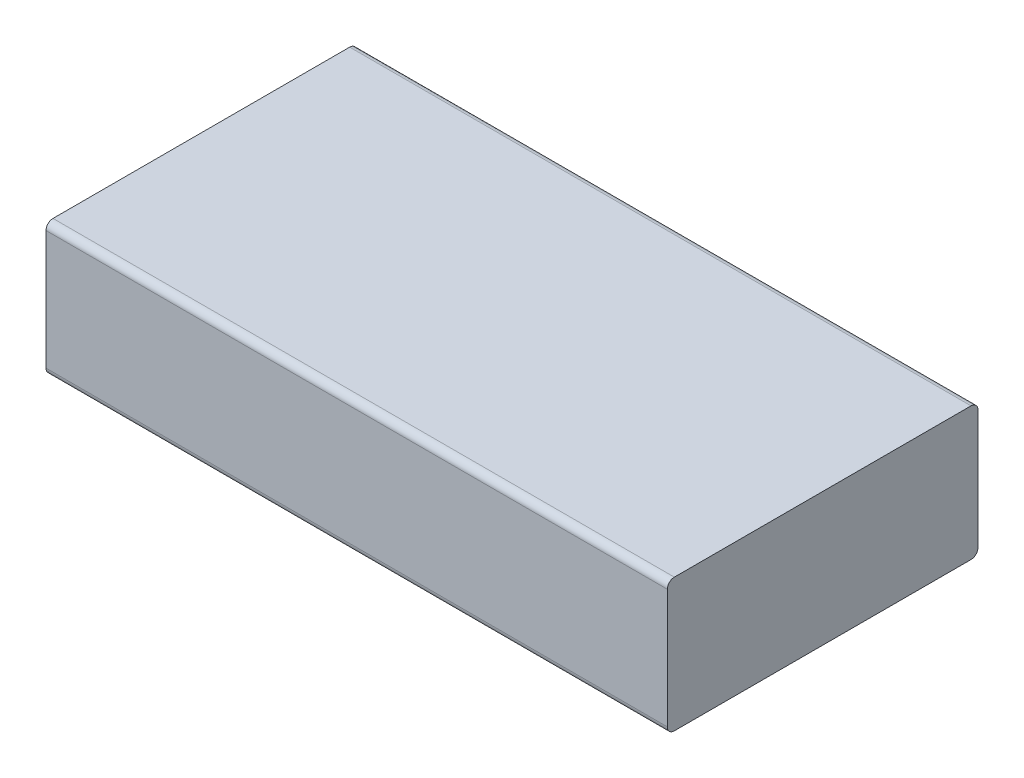
ISO-10303-21;
HEADER;
FILE_DESCRIPTION(('STEP AP214'),'2;1');
FILE_NAME('part.step','',(''),(''),'','','');
FILE_SCHEMA(('AUTOMOTIVE_DESIGN { 1 0 10303 214 1 1 1 1 }'));
ENDSEC;
DATA;
#1=APPLICATION_CONTEXT('core data for automotive mechanical design processes');
#2=APPLICATION_PROTOCOL_DEFINITION('international standard','automotive_design',2000,#1);
#3=PRODUCT_CONTEXT('',#1,'mechanical');
#4=PRODUCT('Part','Part','',(#3));
#5=PRODUCT_RELATED_PRODUCT_CATEGORY('part','',(#4));
#6=PRODUCT_DEFINITION_FORMATION('','',#4);
#7=PRODUCT_DEFINITION_CONTEXT('part definition',#1,'design');
#8=PRODUCT_DEFINITION('design','',#6,#7);
#9=PRODUCT_DEFINITION_SHAPE('','',#8);
#10=(LENGTH_UNIT() NAMED_UNIT(*) SI_UNIT(.MILLI.,.METRE.));
#11=(NAMED_UNIT(*) PLANE_ANGLE_UNIT() SI_UNIT($,.RADIAN.));
#12=(NAMED_UNIT(*) SI_UNIT($,.STERADIAN.) SOLID_ANGLE_UNIT());
#13=UNCERTAINTY_MEASURE_WITH_UNIT(LENGTH_MEASURE(1.E-05),#10,'distance_accuracy_value','');
#14=(GEOMETRIC_REPRESENTATION_CONTEXT(3) GLOBAL_UNCERTAINTY_ASSIGNED_CONTEXT((#13)) GLOBAL_UNIT_ASSIGNED_CONTEXT((#10,
#11,#12)) REPRESENTATION_CONTEXT('',''));
#15=CARTESIAN_POINT('',(0.,0.,0.));
#16=DIRECTION('',(0.,0.,1.));
#17=DIRECTION('',(1.,0.,0.));
#18=AXIS2_PLACEMENT_3D('',#15,#16,#17);
#19=CARTESIAN_POINT('',(177.8,-19.05,-44.45));
#20=DIRECTION('',(0.,0.,1.));
#21=DIRECTION('',(1.,0.,0.));
#22=AXIS2_PLACEMENT_3D('',#19,#20,#21);
#23=PLANE('',#22);
#24=DIRECTION('',(0.,1.,0.));
#25=VECTOR('',#24,1.);
#26=CARTESIAN_POINT('',(0.,-19.05,-44.45));
#27=LINE('',#26,#25);
#28=CARTESIAN_POINT('',(0.,-17.05,-44.45));
#29=VERTEX_POINT('',#28);
#30=CARTESIAN_POINT('',(0.,17.05,-44.45));
#31=VERTEX_POINT('',#30);
#32=EDGE_CURVE('E130',#29,#31,#27,.T.);
#33=ORIENTED_EDGE('',*,*,#32,.T.);
#34=DIRECTION('',(-1.,0.,0.));
#35=VECTOR('',#34,1.);
#36=CARTESIAN_POINT('',(177.8,17.05,-44.45));
#37=LINE('',#36,#35);
#38=CARTESIAN_POINT('',(177.8,17.05,-44.45));
#39=VERTEX_POINT('',#38);
#40=EDGE_CURVE('E153',#31,#39,#37,.F.);
#41=ORIENTED_EDGE('',*,*,#40,.T.);
#42=DIRECTION('',(0.,1.,0.));
#43=VECTOR('',#42,1.);
#44=CARTESIAN_POINT('',(177.8,-19.05,-44.45));
#45=LINE('',#44,#43);
#46=CARTESIAN_POINT('',(177.8,-17.05,-44.45));
#47=VERTEX_POINT('',#46);
#48=EDGE_CURVE('E128',#47,#39,#45,.T.);
#49=ORIENTED_EDGE('',*,*,#48,.F.);
#50=DIRECTION('',(-1.,0.,0.));
#51=VECTOR('',#50,1.);
#52=CARTESIAN_POINT('',(177.8,-17.05,-44.45));
#53=LINE('',#52,#51);
#54=EDGE_CURVE('E150',#47,#29,#53,.T.);
#55=ORIENTED_EDGE('',*,*,#54,.T.);
#56=EDGE_LOOP('',(#33,#41,#49,#55));
#57=FACE_BOUND('',#56,.T.);
#58=ADVANCED_FACE('F35',(#57),#23,.F.);
#59=CARTESIAN_POINT('',(177.8,19.05,44.45));
#60=DIRECTION('',(0.,-1.,0.));
#61=DIRECTION('',(0.,0.,-1.));
#62=AXIS2_PLACEMENT_3D('',#59,#60,#61);
#63=PLANE('',#62);
#64=DIRECTION('',(0.,0.,1.));
#65=VECTOR('',#64,1.);
#66=CARTESIAN_POINT('',(0.,19.05,44.45));
#67=LINE('',#66,#65);
#68=CARTESIAN_POINT('',(0.,19.05,-42.45));
#69=VERTEX_POINT('',#68);
#70=CARTESIAN_POINT('',(0.,19.05,42.45));
#71=VERTEX_POINT('',#70);
#72=EDGE_CURVE('E126',#69,#71,#67,.T.);
#73=ORIENTED_EDGE('',*,*,#72,.T.);
#74=DIRECTION('',(-1.,0.,0.));
#75=VECTOR('',#74,1.);
#76=CARTESIAN_POINT('',(177.8,19.05,42.45));
#77=LINE('',#76,#75);
#78=CARTESIAN_POINT('',(177.8,19.05,42.45));
#79=VERTEX_POINT('',#78);
#80=EDGE_CURVE('E105',#71,#79,#77,.F.);
#81=ORIENTED_EDGE('',*,*,#80,.T.);
#82=DIRECTION('',(0.,0.,1.));
#83=VECTOR('',#82,1.);
#84=CARTESIAN_POINT('',(177.8,19.05,44.45));
#85=LINE('',#84,#83);
#86=CARTESIAN_POINT('',(177.8,19.05,-42.45));
#87=VERTEX_POINT('',#86);
#88=EDGE_CURVE('E169',#87,#79,#85,.T.);
#89=ORIENTED_EDGE('',*,*,#88,.F.);
#90=DIRECTION('',(-1.,0.,0.));
#91=VECTOR('',#90,1.);
#92=CARTESIAN_POINT('',(177.8,19.05,-42.45));
#93=LINE('',#92,#91);
#94=EDGE_CURVE('E110',#87,#69,#93,.T.);
#95=ORIENTED_EDGE('',*,*,#94,.T.);
#96=EDGE_LOOP('',(#73,#81,#89,#95));
#97=FACE_BOUND('',#96,.T.);
#98=ADVANCED_FACE('F186',(#97),#63,.F.);
#99=CARTESIAN_POINT('',(177.8,-19.05,44.45));
#100=DIRECTION('',(0.,0.,-1.));
#101=DIRECTION('',(-1.,0.,0.));
#102=AXIS2_PLACEMENT_3D('',#99,#100,#101);
#103=PLANE('',#102);
#104=DIRECTION('',(0.,-1.,0.));
#105=VECTOR('',#104,1.);
#106=CARTESIAN_POINT('',(177.8,-19.05,44.45));
#107=LINE('',#106,#105);
#108=CARTESIAN_POINT('',(177.8,17.05,44.45));
#109=VERTEX_POINT('',#108);
#110=CARTESIAN_POINT('',(177.8,-17.05,44.45));
#111=VERTEX_POINT('',#110);
#112=EDGE_CURVE('E119',#109,#111,#107,.T.);
#113=ORIENTED_EDGE('',*,*,#112,.F.);
#114=DIRECTION('',(-1.,0.,0.));
#115=VECTOR('',#114,1.);
#116=CARTESIAN_POINT('',(177.8,17.05,44.45));
#117=LINE('',#116,#115);
#118=CARTESIAN_POINT('',(0.,17.05,44.45));
#119=VERTEX_POINT('',#118);
#120=EDGE_CURVE('E104',#109,#119,#117,.T.);
#121=ORIENTED_EDGE('',*,*,#120,.T.);
#122=DIRECTION('',(0.,-1.,0.));
#123=VECTOR('',#122,1.);
#124=CARTESIAN_POINT('',(0.,-19.05,44.45));
#125=LINE('',#124,#123);
#126=CARTESIAN_POINT('',(0.,-17.05,44.45));
#127=VERTEX_POINT('',#126);
#128=EDGE_CURVE('E117',#119,#127,#125,.T.);
#129=ORIENTED_EDGE('',*,*,#128,.T.);
#130=DIRECTION('',(-1.,0.,0.));
#131=VECTOR('',#130,1.);
#132=CARTESIAN_POINT('',(177.8,-17.05,44.45));
#133=LINE('',#132,#131);
#134=EDGE_CURVE('E121',#127,#111,#133,.F.);
#135=ORIENTED_EDGE('',*,*,#134,.T.);
#136=EDGE_LOOP('',(#113,#121,#129,#135));
#137=FACE_BOUND('',#136,.T.);
#138=ADVANCED_FACE('F116',(#137),#103,.F.);
#139=CARTESIAN_POINT('',(177.8,-19.05,44.45));
#140=DIRECTION('',(0.,1.,0.));
#141=DIRECTION('',(0.,0.,1.));
#142=AXIS2_PLACEMENT_3D('',#139,#140,#141);
#143=PLANE('',#142);
#144=DIRECTION('',(0.,0.,-1.));
#145=VECTOR('',#144,1.);
#146=CARTESIAN_POINT('',(0.,-19.05,44.45));
#147=LINE('',#146,#145);
#148=CARTESIAN_POINT('',(0.,-19.05,42.45));
#149=VERTEX_POINT('',#148);
#150=CARTESIAN_POINT('',(0.,-19.05,-42.45));
#151=VERTEX_POINT('',#150);
#152=EDGE_CURVE('E125',#149,#151,#147,.T.);
#153=ORIENTED_EDGE('',*,*,#152,.T.);
#154=DIRECTION('',(-1.,0.,0.));
#155=VECTOR('',#154,1.);
#156=CARTESIAN_POINT('',(177.8,-19.05,-42.45));
#157=LINE('',#156,#155);
#158=CARTESIAN_POINT('',(177.8,-19.05,-42.45));
#159=VERTEX_POINT('',#158);
#160=EDGE_CURVE('E11',#151,#159,#157,.F.);
#161=ORIENTED_EDGE('',*,*,#160,.T.);
#162=DIRECTION('',(0.,0.,-1.));
#163=VECTOR('',#162,1.);
#164=CARTESIAN_POINT('',(177.8,-19.05,44.45));
#165=LINE('',#164,#163);
#166=CARTESIAN_POINT('',(177.8,-19.05,42.45));
#167=VERTEX_POINT('',#166);
#168=EDGE_CURVE('E134',#167,#159,#165,.T.);
#169=ORIENTED_EDGE('',*,*,#168,.F.);
#170=DIRECTION('',(-1.,0.,0.));
#171=VECTOR('',#170,1.);
#172=CARTESIAN_POINT('',(177.8,-19.05,42.45));
#173=LINE('',#172,#171);
#174=EDGE_CURVE('E43',#167,#149,#173,.T.);
#175=ORIENTED_EDGE('',*,*,#174,.T.);
#176=EDGE_LOOP('',(#153,#161,#169,#175));
#177=FACE_BOUND('',#176,.T.);
#178=ADVANCED_FACE('F156',(#177),#143,.F.);
#179=CARTESIAN_POINT('',(177.8,0.,0.));
#180=DIRECTION('',(-1.,0.,0.));
#181=DIRECTION('',(0.,0.,1.));
#182=AXIS2_PLACEMENT_3D('',#179,#180,#181);
#183=PLANE('',#182);
#184=ORIENTED_EDGE('',*,*,#88,.T.);
#185=CARTESIAN_POINT('',(177.8,17.05,42.45));
#186=DIRECTION('',(-1.,0.,0.));
#187=DIRECTION('',(0.,0.,1.));
#188=AXIS2_PLACEMENT_3D('',#185,#186,#187);
#189=CIRCLE('',#188,2.);
#190=EDGE_CURVE('E148',#79,#109,#189,.F.);
#191=ORIENTED_EDGE('',*,*,#190,.T.);
#192=ORIENTED_EDGE('',*,*,#112,.T.);
#193=CARTESIAN_POINT('',(177.8,-17.05,42.45));
#194=DIRECTION('',(-1.,0.,0.));
#195=DIRECTION('',(0.,0.,1.));
#196=AXIS2_PLACEMENT_3D('',#193,#194,#195);
#197=CIRCLE('',#196,2.);
#198=EDGE_CURVE('E55',#111,#167,#197,.F.);
#199=ORIENTED_EDGE('',*,*,#198,.T.);
#200=ORIENTED_EDGE('',*,*,#168,.T.);
#201=CARTESIAN_POINT('',(177.8,-17.05,-42.45));
#202=DIRECTION('',(-1.,0.,0.));
#203=DIRECTION('',(0.,0.,1.));
#204=AXIS2_PLACEMENT_3D('',#201,#202,#203);
#205=CIRCLE('',#204,2.);
#206=EDGE_CURVE('E144',#159,#47,#205,.F.);
#207=ORIENTED_EDGE('',*,*,#206,.T.);
#208=ORIENTED_EDGE('',*,*,#48,.T.);
#209=CARTESIAN_POINT('',(177.8,17.05,-42.45));
#210=DIRECTION('',(-1.,0.,0.));
#211=DIRECTION('',(0.,0.,1.));
#212=AXIS2_PLACEMENT_3D('',#209,#210,#211);
#213=CIRCLE('',#212,2.);
#214=EDGE_CURVE('E146',#39,#87,#213,.F.);
#215=ORIENTED_EDGE('',*,*,#214,.T.);
#216=EDGE_LOOP('',(#184,#191,#192,#199,#200,#207,#208,#215));
#217=FACE_BOUND('',#216,.T.);
#218=ADVANCED_FACE('F175',(#217),#183,.F.);
#219=CARTESIAN_POINT('',(0.,0.,0.));
#220=DIRECTION('',(-1.,0.,0.));
#221=DIRECTION('',(0.,0.,1.));
#222=AXIS2_PLACEMENT_3D('',#219,#220,#221);
#223=PLANE('',#222);
#224=ORIENTED_EDGE('',*,*,#128,.F.);
#225=CARTESIAN_POINT('',(0.,17.05,42.45));
#226=DIRECTION('',(-1.,0.,0.));
#227=DIRECTION('',(0.,0.,1.));
#228=AXIS2_PLACEMENT_3D('',#225,#226,#227);
#229=CIRCLE('',#228,2.);
#230=EDGE_CURVE('E100',#119,#71,#229,.T.);
#231=ORIENTED_EDGE('',*,*,#230,.T.);
#232=ORIENTED_EDGE('',*,*,#72,.F.);
#233=CARTESIAN_POINT('',(0.,17.05,-42.45));
#234=DIRECTION('',(-1.,0.,0.));
#235=DIRECTION('',(0.,0.,1.));
#236=AXIS2_PLACEMENT_3D('',#233,#234,#235);
#237=CIRCLE('',#236,2.);
#238=EDGE_CURVE('E111',#69,#31,#237,.T.);
#239=ORIENTED_EDGE('',*,*,#238,.T.);
#240=ORIENTED_EDGE('',*,*,#32,.F.);
#241=CARTESIAN_POINT('',(0.,-17.05,-42.45));
#242=DIRECTION('',(-1.,0.,0.));
#243=DIRECTION('',(0.,0.,1.));
#244=AXIS2_PLACEMENT_3D('',#241,#242,#243);
#245=CIRCLE('',#244,2.);
#246=EDGE_CURVE('E137',#29,#151,#245,.T.);
#247=ORIENTED_EDGE('',*,*,#246,.T.);
#248=ORIENTED_EDGE('',*,*,#152,.F.);
#249=CARTESIAN_POINT('',(0.,-17.05,42.45));
#250=DIRECTION('',(-1.,0.,0.));
#251=DIRECTION('',(0.,0.,1.));
#252=AXIS2_PLACEMENT_3D('',#249,#250,#251);
#253=CIRCLE('',#252,2.);
#254=EDGE_CURVE('E120',#149,#127,#253,.T.);
#255=ORIENTED_EDGE('',*,*,#254,.T.);
#256=EDGE_LOOP('',(#224,#231,#232,#239,#240,#247,#248,#255));
#257=FACE_BOUND('',#256,.T.);
#258=ADVANCED_FACE('F123',(#257),#223,.T.);
#259=CARTESIAN_POINT('',(177.8,17.05,42.45));
#260=DIRECTION('',(-1.,0.,0.));
#261=DIRECTION('',(0.,0.,1.));
#262=AXIS2_PLACEMENT_3D('',#259,#260,#261);
#263=CYLINDRICAL_SURFACE('',#262,2.);
#264=ORIENTED_EDGE('',*,*,#190,.F.);
#265=ORIENTED_EDGE('',*,*,#80,.F.);
#266=ORIENTED_EDGE('',*,*,#230,.F.);
#267=ORIENTED_EDGE('',*,*,#120,.F.);
#268=EDGE_LOOP('',(#264,#265,#266,#267));
#269=FACE_BOUND('',#268,.T.);
#270=ADVANCED_FACE('F103',(#269),#263,.T.);
#271=CARTESIAN_POINT('',(177.8,17.05,-42.45));
#272=DIRECTION('',(-1.,0.,0.));
#273=DIRECTION('',(0.,0.,1.));
#274=AXIS2_PLACEMENT_3D('',#271,#272,#273);
#275=CYLINDRICAL_SURFACE('',#274,2.);
#276=ORIENTED_EDGE('',*,*,#214,.F.);
#277=ORIENTED_EDGE('',*,*,#40,.F.);
#278=ORIENTED_EDGE('',*,*,#238,.F.);
#279=ORIENTED_EDGE('',*,*,#94,.F.);
#280=EDGE_LOOP('',(#276,#277,#278,#279));
#281=FACE_BOUND('',#280,.T.);
#282=ADVANCED_FACE('F197',(#281),#275,.T.);
#283=CARTESIAN_POINT('',(177.8,-17.05,-42.45));
#284=DIRECTION('',(-1.,0.,0.));
#285=DIRECTION('',(0.,0.,1.));
#286=AXIS2_PLACEMENT_3D('',#283,#284,#285);
#287=CYLINDRICAL_SURFACE('',#286,2.);
#288=ORIENTED_EDGE('',*,*,#206,.F.);
#289=ORIENTED_EDGE('',*,*,#160,.F.);
#290=ORIENTED_EDGE('',*,*,#246,.F.);
#291=ORIENTED_EDGE('',*,*,#54,.F.);
#292=EDGE_LOOP('',(#288,#289,#290,#291));
#293=FACE_BOUND('',#292,.T.);
#294=ADVANCED_FACE('F163',(#293),#287,.T.);
#295=CARTESIAN_POINT('',(177.8,-17.05,42.45));
#296=DIRECTION('',(-1.,0.,0.));
#297=DIRECTION('',(0.,0.,1.));
#298=AXIS2_PLACEMENT_3D('',#295,#296,#297);
#299=CYLINDRICAL_SURFACE('',#298,2.);
#300=ORIENTED_EDGE('',*,*,#198,.F.);
#301=ORIENTED_EDGE('',*,*,#134,.F.);
#302=ORIENTED_EDGE('',*,*,#254,.F.);
#303=ORIENTED_EDGE('',*,*,#174,.F.);
#304=EDGE_LOOP('',(#300,#301,#302,#303));
#305=FACE_BOUND('',#304,.T.);
#306=ADVANCED_FACE('F37',(#305),#299,.T.);
#307=CLOSED_SHELL('',(#58,#98,#138,#178,#218,#258,#270,#282,#294,#306));
#308=MANIFOLD_SOLID_BREP('B2',#307);
#309=ADVANCED_BREP_SHAPE_REPRESENTATION('',(#18,#308),#14);
#310=SHAPE_DEFINITION_REPRESENTATION(#9,#309);
ENDSEC;
END-ISO-10303-21;
